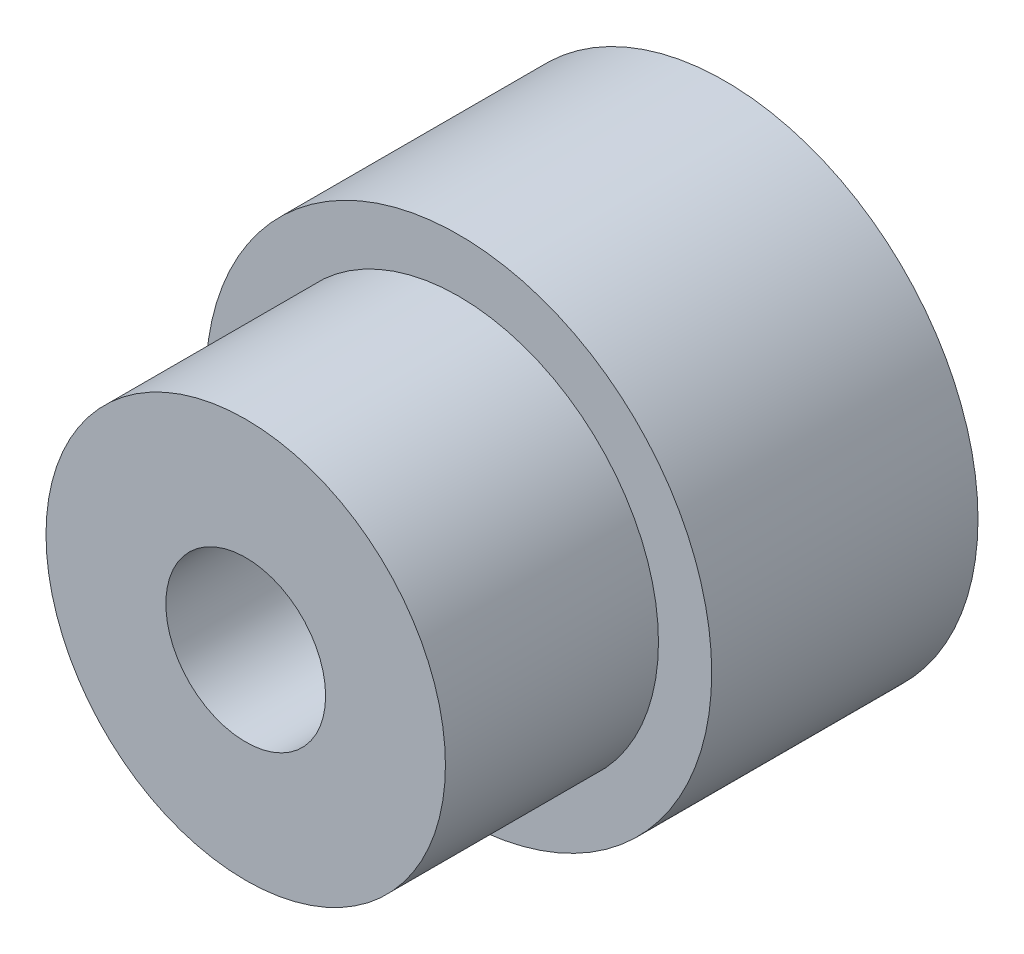
ISO-10303-21;
HEADER;
FILE_DESCRIPTION(('STEP AP214'),'2;1');
FILE_NAME('part.step','',(''),(''),'','','');
FILE_SCHEMA(('AUTOMOTIVE_DESIGN { 1 0 10303 214 1 1 1 1 }'));
ENDSEC;
DATA;
#1=APPLICATION_CONTEXT('core data for automotive mechanical design processes');
#2=APPLICATION_PROTOCOL_DEFINITION('international standard','automotive_design',2000,#1);
#3=PRODUCT_CONTEXT('',#1,'mechanical');
#4=PRODUCT('Part','Part','',(#3));
#5=PRODUCT_RELATED_PRODUCT_CATEGORY('part','',(#4));
#6=PRODUCT_DEFINITION_FORMATION('','',#4);
#7=PRODUCT_DEFINITION_CONTEXT('part definition',#1,'design');
#8=PRODUCT_DEFINITION('design','',#6,#7);
#9=PRODUCT_DEFINITION_SHAPE('','',#8);
#10=(LENGTH_UNIT() NAMED_UNIT(*) SI_UNIT(.MILLI.,.METRE.));
#11=(NAMED_UNIT(*) PLANE_ANGLE_UNIT() SI_UNIT($,.RADIAN.));
#12=(NAMED_UNIT(*) SI_UNIT($,.STERADIAN.) SOLID_ANGLE_UNIT());
#13=UNCERTAINTY_MEASURE_WITH_UNIT(LENGTH_MEASURE(1.E-05),#10,'distance_accuracy_value','');
#14=(GEOMETRIC_REPRESENTATION_CONTEXT(3) GLOBAL_UNCERTAINTY_ASSIGNED_CONTEXT((#13)) GLOBAL_UNIT_ASSIGNED_CONTEXT((#10,
#11,#12)) REPRESENTATION_CONTEXT('',''));
#15=CARTESIAN_POINT('',(0.,0.,0.));
#16=DIRECTION('',(0.,0.,1.));
#17=DIRECTION('',(1.,0.,0.));
#18=AXIS2_PLACEMENT_3D('',#15,#16,#17);
#19=CARTESIAN_POINT('',(0.,0.,10.));
#20=DIRECTION('',(0.,0.,1.));
#21=DIRECTION('',(1.,0.,0.));
#22=AXIS2_PLACEMENT_3D('',#19,#20,#21);
#23=PLANE('',#22);
#24=CARTESIAN_POINT('',(0.,0.,10.));
#25=DIRECTION('',(0.,0.,1.));
#26=DIRECTION('',(1.,0.,0.));
#27=AXIS2_PLACEMENT_3D('',#24,#25,#26);
#28=CIRCLE('',#27,7.5);
#29=CARTESIAN_POINT('',(7.5,0.,10.));
#30=VERTEX_POINT('',#29);
#31=EDGE_CURVE('E10',#30,#30,#28,.T.);
#32=ORIENTED_EDGE('',*,*,#31,.F.);
#33=EDGE_LOOP('',(#32));
#34=FACE_BOUND('',#33,.T.);
#35=CARTESIAN_POINT('',(0.,0.,10.));
#36=DIRECTION('',(0.,0.,1.));
#37=DIRECTION('',(1.,0.,0.));
#38=AXIS2_PLACEMENT_3D('',#35,#36,#37);
#39=CIRCLE('',#38,9.5);
#40=CARTESIAN_POINT('',(9.5,0.,10.));
#41=VERTEX_POINT('',#40);
#42=EDGE_CURVE('E41',#41,#41,#39,.T.);
#43=ORIENTED_EDGE('',*,*,#42,.T.);
#44=EDGE_LOOP('',(#43));
#45=FACE_BOUND('',#44,.T.);
#46=ADVANCED_FACE('F33',(#34,#45),#23,.T.);
#47=CARTESIAN_POINT('',(0.,0.,0.));
#48=DIRECTION('',(0.,0.,1.));
#49=DIRECTION('',(1.,0.,0.));
#50=AXIS2_PLACEMENT_3D('',#47,#48,#49);
#51=PLANE('',#50);
#52=CARTESIAN_POINT('',(0.,0.,0.));
#53=DIRECTION('',(0.,0.,1.));
#54=DIRECTION('',(1.,0.,0.));
#55=AXIS2_PLACEMENT_3D('',#52,#53,#54);
#56=CIRCLE('',#55,9.5);
#57=CARTESIAN_POINT('',(9.5,0.,0.));
#58=VERTEX_POINT('',#57);
#59=EDGE_CURVE('E37',#58,#58,#56,.T.);
#60=ORIENTED_EDGE('',*,*,#59,.F.);
#61=EDGE_LOOP('',(#60));
#62=FACE_BOUND('',#61,.T.);
#63=CARTESIAN_POINT('',(0.,0.,0.));
#64=DIRECTION('',(0.,0.,1.));
#65=DIRECTION('',(1.,0.,0.));
#66=AXIS2_PLACEMENT_3D('',#63,#64,#65);
#67=CIRCLE('',#66,3.);
#68=CARTESIAN_POINT('',(3.,0.,0.));
#69=VERTEX_POINT('',#68);
#70=EDGE_CURVE('E50',#69,#69,#67,.T.);
#71=ORIENTED_EDGE('',*,*,#70,.T.);
#72=EDGE_LOOP('',(#71));
#73=FACE_BOUND('',#72,.T.);
#74=ADVANCED_FACE('F77',(#62,#73),#51,.F.);
#75=CARTESIAN_POINT('',(0.,0.,10.));
#76=DIRECTION('',(0.,0.,-1.));
#77=DIRECTION('',(-1.,0.,0.));
#78=AXIS2_PLACEMENT_3D('',#75,#76,#77);
#79=CYLINDRICAL_SURFACE('',#78,9.5);
#80=ORIENTED_EDGE('',*,*,#42,.F.);
#81=EDGE_LOOP('',(#80));
#82=FACE_BOUND('',#81,.T.);
#83=ORIENTED_EDGE('',*,*,#59,.T.);
#84=EDGE_LOOP('',(#83));
#85=FACE_BOUND('',#84,.T.);
#86=ADVANCED_FACE('F35',(#82,#85),#79,.T.);
#87=CARTESIAN_POINT('',(0.,0.,10.));
#88=DIRECTION('',(0.,0.,-1.));
#89=DIRECTION('',(-1.,0.,0.));
#90=AXIS2_PLACEMENT_3D('',#87,#88,#89);
#91=CYLINDRICAL_SURFACE('',#90,3.);
#92=ORIENTED_EDGE('',*,*,#70,.F.);
#93=EDGE_LOOP('',(#92));
#94=FACE_BOUND('',#93,.T.);
#95=CARTESIAN_POINT('',(0.,0.,18.));
#96=DIRECTION('',(0.,0.,1.));
#97=DIRECTION('',(1.,0.,0.));
#98=AXIS2_PLACEMENT_3D('',#95,#96,#97);
#99=CIRCLE('',#98,3.);
#100=CARTESIAN_POINT('',(3.,0.,18.));
#101=VERTEX_POINT('',#100);
#102=EDGE_CURVE('E56',#101,#101,#99,.T.);
#103=ORIENTED_EDGE('',*,*,#102,.T.);
#104=EDGE_LOOP('',(#103));
#105=FACE_BOUND('',#104,.T.);
#106=ADVANCED_FACE('F62',(#94,#105),#91,.F.);
#107=CARTESIAN_POINT('',(0.,0.,18.));
#108=DIRECTION('',(0.,0.,1.));
#109=DIRECTION('',(1.,0.,0.));
#110=AXIS2_PLACEMENT_3D('',#107,#108,#109);
#111=PLANE('',#110);
#112=CARTESIAN_POINT('',(0.,0.,18.));
#113=DIRECTION('',(0.,0.,1.));
#114=DIRECTION('',(1.,0.,0.));
#115=AXIS2_PLACEMENT_3D('',#112,#113,#114);
#116=CIRCLE('',#115,7.5);
#117=CARTESIAN_POINT('',(7.5,0.,18.));
#118=VERTEX_POINT('',#117);
#119=EDGE_CURVE('E48',#118,#118,#116,.T.);
#120=ORIENTED_EDGE('',*,*,#119,.T.);
#121=EDGE_LOOP('',(#120));
#122=FACE_BOUND('',#121,.T.);
#123=ORIENTED_EDGE('',*,*,#102,.F.);
#124=EDGE_LOOP('',(#123));
#125=FACE_BOUND('',#124,.T.);
#126=ADVANCED_FACE('F64',(#122,#125),#111,.T.);
#127=CARTESIAN_POINT('',(0.,0.,18.));
#128=DIRECTION('',(0.,0.,-1.));
#129=DIRECTION('',(-1.,0.,0.));
#130=AXIS2_PLACEMENT_3D('',#127,#128,#129);
#131=CYLINDRICAL_SURFACE('',#130,7.5);
#132=ORIENTED_EDGE('',*,*,#119,.F.);
#133=EDGE_LOOP('',(#132));
#134=FACE_BOUND('',#133,.T.);
#135=ORIENTED_EDGE('',*,*,#31,.T.);
#136=EDGE_LOOP('',(#135));
#137=FACE_BOUND('',#136,.T.);
#138=ADVANCED_FACE('F66',(#134,#137),#131,.T.);
#139=CLOSED_SHELL('',(#46,#74,#86,#106,#126,#138));
#140=MANIFOLD_SOLID_BREP('B2',#139);
#141=ADVANCED_BREP_SHAPE_REPRESENTATION('',(#18,#140),#14);
#142=SHAPE_DEFINITION_REPRESENTATION(#9,#141);
ENDSEC;
END-ISO-10303-21;
